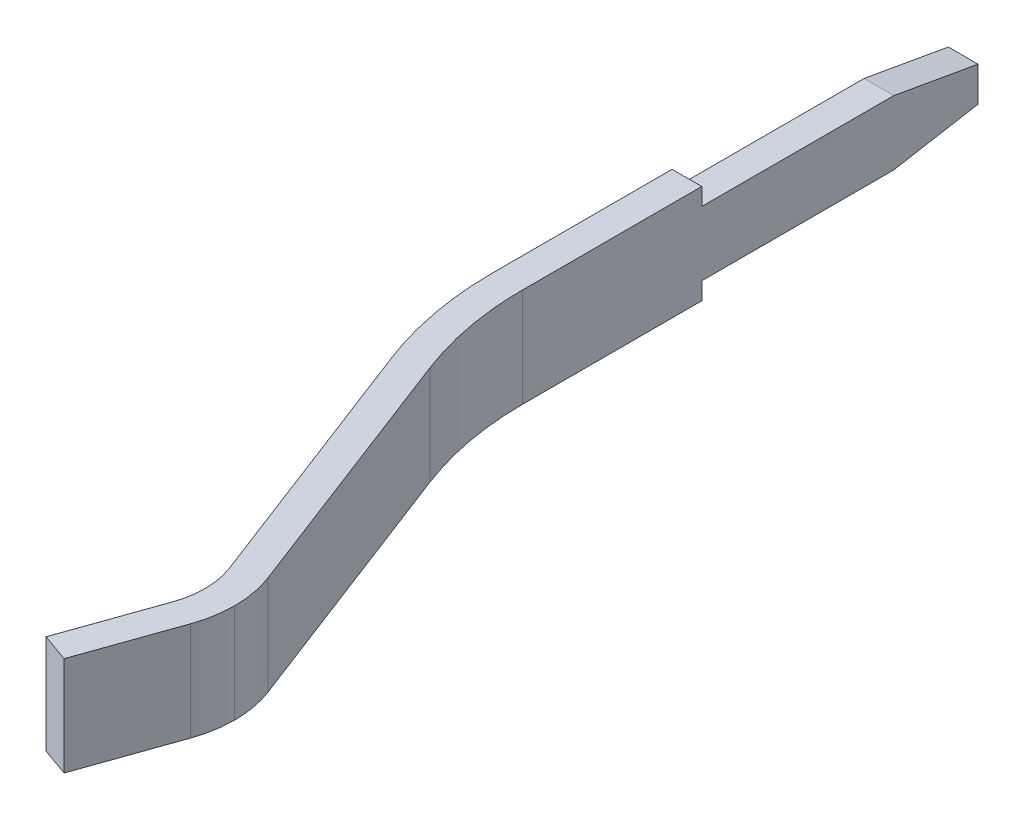
ISO-10303-21;
HEADER;
FILE_DESCRIPTION(('STEP AP214'),'2;1');
FILE_NAME('part.step','',(''),(''),'','','');
FILE_SCHEMA(('AUTOMOTIVE_DESIGN { 1 0 10303 214 1 1 1 1 }'));
ENDSEC;
DATA;
#1=APPLICATION_CONTEXT('core data for automotive mechanical design processes');
#2=APPLICATION_PROTOCOL_DEFINITION('international standard','automotive_design',2000,#1);
#3=PRODUCT_CONTEXT('',#1,'mechanical');
#4=PRODUCT('Part','Part','',(#3));
#5=PRODUCT_RELATED_PRODUCT_CATEGORY('part','',(#4));
#6=PRODUCT_DEFINITION_FORMATION('','',#4);
#7=PRODUCT_DEFINITION_CONTEXT('part definition',#1,'design');
#8=PRODUCT_DEFINITION('design','',#6,#7);
#9=PRODUCT_DEFINITION_SHAPE('','',#8);
#10=(LENGTH_UNIT() NAMED_UNIT(*) SI_UNIT(.MILLI.,.METRE.));
#11=(NAMED_UNIT(*) PLANE_ANGLE_UNIT() SI_UNIT($,.RADIAN.));
#12=(NAMED_UNIT(*) SI_UNIT($,.STERADIAN.) SOLID_ANGLE_UNIT());
#13=UNCERTAINTY_MEASURE_WITH_UNIT(LENGTH_MEASURE(1.E-05),#10,'distance_accuracy_value','');
#14=(GEOMETRIC_REPRESENTATION_CONTEXT(3) GLOBAL_UNCERTAINTY_ASSIGNED_CONTEXT((#13)) GLOBAL_UNIT_ASSIGNED_CONTEXT((#10,
#11,#12)) REPRESENTATION_CONTEXT('',''));
#15=CARTESIAN_POINT('',(0.,0.,0.));
#16=DIRECTION('',(0.,0.,1.));
#17=DIRECTION('',(1.,0.,0.));
#18=AXIS2_PLACEMENT_3D('',#15,#16,#17);
#19=CARTESIAN_POINT('',(137.95048969605,16.402694125595,6.525238669739));
#20=DIRECTION('',(4.371138828674E-08,-1.,0.));
#21=DIRECTION('',(1.,4.37113882867399E-08,-4.37114091299599E-08));
#22=AXIS2_PLACEMENT_3D('',#19,#20,#21);
#23=CYLINDRICAL_SURFACE('',#22,0.85);
#24=CARTESIAN_POINT('',(138.80048969605,16.40269416275,6.5252386325843));
#25=DIRECTION('',(4.37113956142099E-08,-0.999999999999999,0.));
#26=VECTOR('',#25,1.);
#27=LINE('',#24,#26);
#28=CARTESIAN_POINT('',(138.80048969605,16.4026941627497,6.5252386325842));
#29=VERTEX_POINT('',#28);
#30=CARTESIAN_POINT('',(138.800489739761,15.4026941627497,6.5252386325842));
#31=VERTEX_POINT('',#30);
#32=EDGE_CURVE('E166',#29,#31,#27,.T.);
#33=ORIENTED_EDGE('',*,*,#32,.T.);
#34=CARTESIAN_POINT('',(138.75187743749,15.4026941606245,6.80857196804195));
#35=CARTESIAN_POINT('',(138.800489746135,15.4026941627494,6.67107557654959));
#36=CARTESIAN_POINT('',(138.80048973976,15.4026941627494,6.525238632584));
#37=B_SPLINE_CURVE_WITH_KNOTS('',2,(#34,#35,#36),.UNSPECIFIED.,.F.,.F.,(3,3),(0.,1.),.UNSPECIFIED.);
#38=CARTESIAN_POINT('',(138.751877437488,15.4026941606248,6.80857196804117));
#39=VERTEX_POINT('',#38);
#40=EDGE_CURVE('E155',#39,#31,#37,.T.);
#41=ORIENTED_EDGE('',*,*,#40,.F.);
#42=CARTESIAN_POINT('',(138.751877437491,15.402694160625,6.80857196804195));
#43=DIRECTION('',(-4.37113956142097E-08,0.999999999999999,0.));
#44=VECTOR('',#43,1.);
#45=LINE('',#42,#44);
#46=CARTESIAN_POINT('',(138.751877393777,16.4026941606248,6.80857196804103));
#47=VERTEX_POINT('',#46);
#48=EDGE_CURVE('E162',#39,#47,#45,.T.);
#49=ORIENTED_EDGE('',*,*,#48,.T.);
#50=CARTESIAN_POINT('',(138.80048969605,16.4026941627494,6.525238632584));
#51=CARTESIAN_POINT('',(138.800489702425,16.4026941627494,6.67107557654959));
#52=CARTESIAN_POINT('',(138.75187739378,16.4026941606245,6.80857196804195));
#53=B_SPLINE_CURVE_WITH_KNOTS('',2,(#50,#51,#52),.UNSPECIFIED.,.F.,.F.,(3,3),(0.,1.),.UNSPECIFIED.);
#54=EDGE_CURVE('E170',#29,#47,#53,.T.);
#55=ORIENTED_EDGE('',*,*,#54,.F.);
#56=EDGE_LOOP('',(#33,#41,#49,#55));
#57=FACE_BOUND('',#56,.T.);
#58=ADVANCED_FACE('F18',(#57),#23,.F.);
#59=CARTESIAN_POINT('',(137.72435068274,16.40269411571,3.564294018732));
#60=DIRECTION('',(0.933579004112615,4.08080343451031E-08,-0.358371654961852));
#61=DIRECTION('',(0.,-1.,-1.13870708746334E-07));
#62=AXIS2_PLACEMENT_3D('',#59,#60,#61);
#63=PLANE('',#62);
#64=CARTESIAN_POINT('',(138.744031893251,15.402694160282,6.220622763021));
#65=DIRECTION('',(-4.37113956142095E-08,0.999999999999999,0.));
#66=VECTOR('',#65,1.);
#67=LINE('',#64,#66);
#68=CARTESIAN_POINT('',(138.744031893253,15.4026941602818,6.2206227630199));
#69=VERTEX_POINT('',#68);
#70=CARTESIAN_POINT('',(138.744031849542,16.4026941602817,6.22062276302006));
#71=VERTEX_POINT('',#70);
#72=EDGE_CURVE('E1408',#69,#71,#67,.T.);
#73=ORIENTED_EDGE('',*,*,#72,.T.);
#74=CARTESIAN_POINT('',(137.72435068274,16.4026941157099,3.564294018732));
#75=DIRECTION('',(0.35837165496185,1.56649226558017E-08,0.933579004112617));
#76=VECTOR('',#75,1.);
#77=LINE('',#74,#76);
#78=CARTESIAN_POINT('',(137.724350682742,16.40269411571,3.56429401873105));
#79=VERTEX_POINT('',#78);
#80=EDGE_CURVE('E1329',#79,#71,#77,.T.);
#81=ORIENTED_EDGE('',*,*,#80,.F.);
#82=CARTESIAN_POINT('',(137.724350726456,15.40269411571,3.5642940187301));
#83=DIRECTION('',(-4.37113956142099E-08,0.999999999999999,0.));
#84=VECTOR('',#83,1.);
#85=LINE('',#82,#84);
#86=CARTESIAN_POINT('',(137.724350726453,15.40269411571,3.5642940187309));
#87=VERTEX_POINT('',#86);
#88=EDGE_CURVE('E1343',#87,#79,#85,.T.);
#89=ORIENTED_EDGE('',*,*,#88,.F.);
#90=CARTESIAN_POINT('',(137.724350726451,15.40269411571,3.56429401873153));
#91=DIRECTION('',(0.358371654961855,1.56649250945078E-08,0.933579004112614));
#92=VECTOR('',#91,1.);
#93=LINE('',#90,#92);
#94=EDGE_CURVE('E1289',#87,#69,#93,.T.);
#95=ORIENTED_EDGE('',*,*,#94,.T.);
#96=EDGE_LOOP('',(#73,#81,#89,#95));
#97=FACE_BOUND('',#96,.T.);
#98=ADVANCED_FACE('F1441',(#97),#63,.F.);
#99=CARTESIAN_POINT('',(137.95048969605,16.402694125595,6.525238669739));
#100=DIRECTION('',(4.371138828674E-08,-1.,0.));
#101=DIRECTION('',(1.,4.37113882867399E-08,-4.37114091299599E-08));
#102=AXIS2_PLACEMENT_3D('',#99,#100,#101);
#103=CYLINDRICAL_SURFACE('',#102,0.85);
#104=CARTESIAN_POINT('',(138.744031849545,16.4026941602816,6.22062276301914));
#105=CARTESIAN_POINT('',(138.800489689164,16.4026941627494,6.36769871881936));
#106=CARTESIAN_POINT('',(138.80048969605,16.4026941627494,6.525238632584));
#107=B_SPLINE_CURVE_WITH_KNOTS('',2,(#104,#105,#106),.UNSPECIFIED.,.F.,.F.,(3,3),(0.,1.),.UNSPECIFIED.);
#108=EDGE_CURVE('E1324',#71,#29,#107,.T.);
#109=ORIENTED_EDGE('',*,*,#108,.F.);
#110=ORIENTED_EDGE('',*,*,#72,.F.);
#111=CARTESIAN_POINT('',(137.950489739761,15.402694125595,6.525238669739));
#112=DIRECTION('',(4.371138828674E-08,-1.,0.));
#113=DIRECTION('',(0.933579004111373,4.08080370965545E-08,-0.358371654965086));
#114=AXIS2_PLACEMENT_3D('',#111,#112,#113);
#115=CIRCLE('',#114,0.850000000000002);
#116=EDGE_CURVE('E193',#69,#31,#115,.T.);
#117=ORIENTED_EDGE('',*,*,#116,.T.);
#118=ORIENTED_EDGE('',*,*,#32,.F.);
#119=EDGE_LOOP('',(#109,#110,#117,#118));
#120=FACE_BOUND('',#119,.T.);
#121=ADVANCED_FACE('F1381',(#120),#103,.F.);
#122=CARTESIAN_POINT('',(138.41903472245,16.402694146076,7.749993338829));
#123=DIRECTION('',(0.942809056152527,4.12114927337194E-08,0.333333292121833));
#124=DIRECTION('',(0.,-1.,1.23634493486646E-07));
#125=AXIS2_PLACEMENT_3D('',#122,#123,#124);
#126=PLANE('',#125);
#127=CARTESIAN_POINT('',(138.419034766161,15.402694146076,7.74999333882899));
#128=DIRECTION('',(-4.37113956142092E-08,0.999999999999999,0.));
#129=VECTOR('',#128,1.);
#130=LINE('',#127,#129);
#131=CARTESIAN_POINT('',(138.419034766161,15.4026941460757,7.74999333882809));
#132=VERTEX_POINT('',#131);
#133=CARTESIAN_POINT('',(138.41903472245,16.4026941460758,7.74999333882809));
#134=VERTEX_POINT('',#133);
#135=EDGE_CURVE('E183',#132,#134,#130,.T.);
#136=ORIENTED_EDGE('',*,*,#135,.T.);
#137=CARTESIAN_POINT('',(138.751877393775,16.4026941606245,6.80857196804012));
#138=DIRECTION('',(-0.333333292121842,-1.45704604861822E-08,0.942809056152525));
#139=VECTOR('',#138,1.);
#140=LINE('',#137,#139);
#141=EDGE_CURVE('E180',#47,#134,#140,.T.);
#142=ORIENTED_EDGE('',*,*,#141,.F.);
#143=ORIENTED_EDGE('',*,*,#48,.F.);
#144=CARTESIAN_POINT('',(138.751877437486,15.402694160625,6.80857196804054));
#145=DIRECTION('',(-0.333333292121838,-1.45704674353041E-08,0.942809056152526));
#146=VECTOR('',#145,1.);
#147=LINE('',#144,#146);
#148=EDGE_CURVE('E176',#39,#132,#147,.T.);
#149=ORIENTED_EDGE('',*,*,#148,.T.);
#150=EDGE_LOOP('',(#136,#142,#143,#149));
#151=FACE_BOUND('',#150,.T.);
#152=ADVANCED_FACE('F175',(#151),#126,.F.);
#153=CARTESIAN_POINT('',(138.7018774393,16.402694158439,7.849993326465));
#154=DIRECTION('',(0.333333292121833,1.45704609608227E-08,-0.942809056152528));
#155=DIRECTION('',(0.,-1.,-1.54543073867817E-08));
#156=AXIS2_PLACEMENT_3D('',#153,#154,#155);
#157=PLANE('',#156);
#158=CARTESIAN_POINT('',(138.701877483011,15.402694158439,7.849993326465));
#159=DIRECTION('',(-4.37113956142098E-08,0.999999999999999,0.));
#160=VECTOR('',#159,1.);
#161=LINE('',#158,#160);
#162=CARTESIAN_POINT('',(138.701877483011,15.402694158439,7.849993326465));
#163=VERTEX_POINT('',#162);
#164=CARTESIAN_POINT('',(138.7018774393,16.402694158439,7.849993326465));
#165=VERTEX_POINT('',#164);
#166=EDGE_CURVE('E759',#163,#165,#161,.T.);
#167=ORIENTED_EDGE('',*,*,#166,.T.);
#168=CARTESIAN_POINT('',(138.419034722451,16.4026941460755,7.74999333882717));
#169=DIRECTION('',(0.942809056152521,4.12114902383835E-08,0.333333292121849));
#170=VECTOR('',#169,1.);
#171=LINE('',#168,#170);
#172=EDGE_CURVE('E814',#134,#165,#171,.T.);
#173=ORIENTED_EDGE('',*,*,#172,.F.);
#174=ORIENTED_EDGE('',*,*,#135,.F.);
#175=CARTESIAN_POINT('',(138.419034766161,15.4026941460756,7.74999333882675));
#176=DIRECTION('',(0.942809056152528,4.12114902383838E-08,0.333333292121831));
#177=VECTOR('',#176,1.);
#178=LINE('',#175,#177);
#179=EDGE_CURVE('E190',#132,#163,#178,.T.);
#180=ORIENTED_EDGE('',*,*,#179,.T.);
#181=EDGE_LOOP('',(#167,#173,#174,#180));
#182=FACE_BOUND('',#181,.T.);
#183=ADVANCED_FACE('F773',(#182),#157,.F.);
#184=CARTESIAN_POINT('',(138.7018774393,16.402694158439,7.849993326465));
#185=DIRECTION('',(-0.942809056152527,-4.12114927337194E-08,-0.333333292121833));
#186=DIRECTION('',(-0.333333292121833,0.,0.942809056152528));
#187=AXIS2_PLACEMENT_3D('',#184,#185,#186);
#188=PLANE('',#187);
#189=CARTESIAN_POINT('',(139.034720110625,16.402694172988,6.90857195568072));
#190=DIRECTION('',(4.37113956142097E-08,-0.999999999999999,0.));
#191=VECTOR('',#190,1.);
#192=LINE('',#189,#191);
#193=CARTESIAN_POINT('',(139.034720110624,16.402694172988,6.90857195568044));
#194=VERTEX_POINT('',#193);
#195=CARTESIAN_POINT('',(139.034720154335,15.402694172988,6.90857195568058));
#196=VERTEX_POINT('',#195);
#197=EDGE_CURVE('E735',#194,#196,#192,.T.);
#198=ORIENTED_EDGE('',*,*,#197,.F.);
#199=CARTESIAN_POINT('',(138.7018774393,16.4026941584389,7.849993326465));
#200=DIRECTION('',(0.33333329212183,1.45704604862449E-08,-0.942809056152529));
#201=VECTOR('',#200,1.);
#202=LINE('',#199,#201);
#203=EDGE_CURVE('E1314',#165,#194,#202,.T.);
#204=ORIENTED_EDGE('',*,*,#203,.F.);
#205=ORIENTED_EDGE('',*,*,#166,.F.);
#206=CARTESIAN_POINT('',(138.701877483011,15.402694158439,7.84999332646544));
#207=DIRECTION('',(0.33333329212183,1.45704587489644E-08,-0.942809056152529));
#208=VECTOR('',#207,1.);
#209=LINE('',#206,#208);
#210=EDGE_CURVE('E792',#163,#196,#209,.T.);
#211=ORIENTED_EDGE('',*,*,#210,.T.);
#212=EDGE_LOOP('',(#198,#204,#205,#211));
#213=FACE_BOUND('',#212,.T.);
#214=ADVANCED_FACE('F764',(#213),#188,.F.);
#215=CARTESIAN_POINT('',(137.95048969605,16.402694125595,6.525238669739));
#216=DIRECTION('',(4.371138828674E-08,-1.,0.));
#217=DIRECTION('',(1.,4.37113882867399E-08,-4.37114091299599E-08));
#218=AXIS2_PLACEMENT_3D('',#215,#216,#217);
#219=CYLINDRICAL_SURFACE('',#218,1.15);
#220=ORIENTED_EDGE('',*,*,#197,.T.);
#221=CARTESIAN_POINT('',(137.950489739761,15.402694125595,6.525238669739));
#222=DIRECTION('',(-4.371138828674E-08,1.,0.));
#223=DIRECTION('',(0.942809056151897,4.12114937586381E-08,0.333333292123615));
#224=AXIS2_PLACEMENT_3D('',#221,#222,#223);
#225=CIRCLE('',#224,1.14999999999999);
#226=CARTESIAN_POINT('',(139.100489739761,15.402694175863,6.52523861947092));
#227=VERTEX_POINT('',#226);
#228=EDGE_CURVE('E746',#196,#227,#225,.T.);
#229=ORIENTED_EDGE('',*,*,#228,.T.);
#230=CARTESIAN_POINT('',(139.10048969605,16.402694175863,6.52523861947088));
#231=DIRECTION('',(4.37113678586342E-08,-0.999999999999999,0.));
#232=VECTOR('',#231,1.);
#233=LINE('',#230,#232);
#234=CARTESIAN_POINT('',(139.10048969605,16.4026941758629,6.52523861947092));
#235=VERTEX_POINT('',#234);
#236=EDGE_CURVE('E713',#235,#227,#233,.T.);
#237=ORIENTED_EDGE('',*,*,#236,.F.);
#238=CARTESIAN_POINT('',(139.034720110625,16.4026941729879,6.90857195568072));
#239=CARTESIAN_POINT('',(139.100489704675,16.4026941758628,6.72254742601374));
#240=CARTESIAN_POINT('',(139.10048969605,16.4026941758628,6.525238619471));
#241=B_SPLINE_CURVE_WITH_KNOTS('',2,(#238,#239,#240),.UNSPECIFIED.,.F.,.F.,(3,3),(0.,1.),.UNSPECIFIED.);
#242=EDGE_CURVE('E724',#194,#235,#241,.T.);
#243=ORIENTED_EDGE('',*,*,#242,.F.);
#244=EDGE_LOOP('',(#220,#229,#237,#243));
#245=FACE_BOUND('',#244,.T.);
#246=ADVANCED_FACE('F683',(#245),#219,.T.);
#247=CARTESIAN_POINT('',(137.95048969605,16.402694125595,6.525238669739));
#248=DIRECTION('',(4.371138828674E-08,-1.,0.));
#249=DIRECTION('',(1.,4.37113882867399E-08,-4.37114091299599E-08));
#250=AXIS2_PLACEMENT_3D('',#247,#248,#249);
#251=CYLINDRICAL_SURFACE('',#250,1.15);
#252=CARTESIAN_POINT('',(137.950489739761,15.402694125595,6.525238669739));
#253=DIRECTION('',(-4.371138828674E-08,1.,0.));
#254=DIRECTION('',(0.999999999999998,4.37113901837717E-08,-4.37114052683237E-08));
#255=AXIS2_PLACEMENT_3D('',#252,#253,#254);
#256=CIRCLE('',#255,1.14999999999999);
#257=CARTESIAN_POINT('',(139.024105594491,15.4026941725241,6.11311126653292));
#258=VERTEX_POINT('',#257);
#259=EDGE_CURVE('E850',#227,#258,#256,.T.);
#260=ORIENTED_EDGE('',*,*,#259,.T.);
#261=CARTESIAN_POINT('',(139.024105594491,15.402694172524,6.11311126653315));
#262=DIRECTION('',(-4.37113956142098E-08,0.999999999999999,0.));
#263=VECTOR('',#262,1.);
#264=LINE('',#261,#263);
#265=CARTESIAN_POINT('',(139.02410555078,16.4026941725241,6.11311126653308));
#266=VERTEX_POINT('',#265);
#267=EDGE_CURVE('E624',#258,#266,#264,.T.);
#268=ORIENTED_EDGE('',*,*,#267,.T.);
#269=CARTESIAN_POINT('',(139.10048969605,16.4026941758628,6.525238619471));
#270=CARTESIAN_POINT('',(139.100489686733,16.4026941758628,6.31209638320274));
#271=CARTESIAN_POINT('',(139.02410555078,16.402694172524,6.11311126653315));
#272=B_SPLINE_CURVE_WITH_KNOTS('',2,(#269,#270,#271),.UNSPECIFIED.,.F.,.F.,(3,3),(0.,1.),.UNSPECIFIED.);
#273=EDGE_CURVE('E668',#235,#266,#272,.T.);
#274=ORIENTED_EDGE('',*,*,#273,.F.);
#275=ORIENTED_EDGE('',*,*,#236,.T.);
#276=EDGE_LOOP('',(#260,#268,#274,#275));
#277=FACE_BOUND('',#276,.T.);
#278=ADVANCED_FACE('F674',(#277),#251,.T.);
#279=CARTESIAN_POINT('',(139.02410555078,16.402694172524,6.113111266533));
#280=DIRECTION('',(-0.933579004112615,-4.08080343451031E-08,0.358371654961852));
#281=DIRECTION('',(-4.37113882867278E-08,1.,0.));
#282=AXIS2_PLACEMENT_3D('',#279,#280,#281);
#283=PLANE('',#282);
#284=CARTESIAN_POINT('',(138.004424427691,15.402694127953,3.45678252224401));
#285=DIRECTION('',(-4.37113678586342E-08,0.999999999999999,0.));
#286=VECTOR('',#285,1.);
#287=LINE('',#284,#286);
#288=CARTESIAN_POINT('',(138.004424427691,15.4026941279526,3.45678252224391));
#289=VERTEX_POINT('',#288);
#290=CARTESIAN_POINT('',(138.00442438398,16.4026941279525,3.45678252224406));
#291=VERTEX_POINT('',#290);
#292=EDGE_CURVE('E530',#289,#291,#287,.T.);
#293=ORIENTED_EDGE('',*,*,#292,.T.);
#294=CARTESIAN_POINT('',(139.02410555078,16.402694172524,6.113111266533));
#295=DIRECTION('',(-0.358371654961849,-1.56649226558016E-08,-0.933579004112617));
#296=VECTOR('',#295,1.);
#297=LINE('',#294,#296);
#298=EDGE_CURVE('E635',#266,#291,#297,.T.);
#299=ORIENTED_EDGE('',*,*,#298,.F.);
#300=ORIENTED_EDGE('',*,*,#267,.F.);
#301=CARTESIAN_POINT('',(139.024105594491,15.402694172524,6.11311126653253));
#302=DIRECTION('',(-0.358371654961849,-1.56649220461251E-08,-0.933579004112617));
#303=VECTOR('',#302,1.);
#304=LINE('',#301,#303);
#305=EDGE_CURVE('E655',#258,#289,#304,.T.);
#306=ORIENTED_EDGE('',*,*,#305,.T.);
#307=EDGE_LOOP('',(#293,#299,#300,#306));
#308=FACE_BOUND('',#307,.T.);
#309=ADVANCED_FACE('F591',(#308),#283,.F.);
#310=CARTESIAN_POINT('',(140.99187719714,16.402694258538,2.309993226366));
#311=DIRECTION('',(4.371138828674E-08,-1.,0.));
#312=DIRECTION('',(1.,4.37113882867399E-08,-4.37114091299599E-08));
#313=AXIS2_PLACEMENT_3D('',#310,#311,#312);
#314=CYLINDRICAL_SURFACE('',#313,3.5);
#315=CARTESIAN_POINT('',(137.49187719714,16.4026941055481,2.30999337935593));
#316=CARTESIAN_POINT('',(137.491877225495,16.4026941055481,2.95868714191033));
#317=CARTESIAN_POINT('',(137.724350682745,16.4026941157099,3.5642940187301));
#318=B_SPLINE_CURVE_WITH_KNOTS('',2,(#315,#316,#317),.UNSPECIFIED.,.F.,.F.,(3,3),(0.,1.),.UNSPECIFIED.);
#319=CARTESIAN_POINT('',(137.491877197136,16.4026941055486,2.30999337935598));
#320=VERTEX_POINT('',#319);
#321=EDGE_CURVE('E1335',#320,#79,#318,.T.);
#322=ORIENTED_EDGE('',*,*,#321,.F.);
#323=CARTESIAN_POINT('',(137.49187719714,16.402694105549,2.30999337935599));
#324=DIRECTION('',(4.37113956142097E-08,-0.999999999999999,0.));
#325=VECTOR('',#324,1.);
#326=LINE('',#323,#325);
#327=CARTESIAN_POINT('',(137.491877240847,15.4026941055485,2.30999337935598));
#328=VERTEX_POINT('',#327);
#329=EDGE_CURVE('E611',#320,#328,#326,.T.);
#330=ORIENTED_EDGE('',*,*,#329,.T.);
#331=CARTESIAN_POINT('',(140.991877240851,15.402694258538,2.309993226366));
#332=DIRECTION('',(-4.371138828674E-08,1.,0.));
#333=DIRECTION('',(-0.999999999999998,-4.37113876840453E-08,4.37114070138212E-08));
#334=AXIS2_PLACEMENT_3D('',#331,#332,#333);
#335=CIRCLE('',#334,3.50000000000001);
#336=EDGE_CURVE('E576',#328,#87,#335,.T.);
#337=ORIENTED_EDGE('',*,*,#336,.T.);
#338=ORIENTED_EDGE('',*,*,#88,.T.);
#339=EDGE_LOOP('',(#322,#330,#337,#338));
#340=FACE_BOUND('',#339,.T.);
#341=ADVANCED_FACE('F582',(#340),#314,.T.);
#342=CARTESIAN_POINT('',(140.99187719714,16.402694258538,2.309993226366));
#343=DIRECTION('',(4.371138828674E-08,-1.,0.));
#344=DIRECTION('',(1.,4.37113882867399E-08,-4.37114091299599E-08));
#345=AXIS2_PLACEMENT_3D('',#342,#343,#344);
#346=CYLINDRICAL_SURFACE('',#345,3.2);
#347=CARTESIAN_POINT('',(137.791877240851,15.402694118662,2.309993366243));
#348=DIRECTION('',(-4.37113956142097E-08,0.999999999999999,0.));
#349=VECTOR('',#348,1.);
#350=LINE('',#347,#349);
#351=CARTESIAN_POINT('',(137.791877240851,15.4026941186618,2.30999336624283));
#352=VERTEX_POINT('',#351);
#353=CARTESIAN_POINT('',(137.79187719714,16.4026941186618,2.30999336624283));
#354=VERTEX_POINT('',#353);
#355=EDGE_CURVE('E553',#352,#354,#350,.T.);
#356=ORIENTED_EDGE('',*,*,#355,.T.);
#357=CARTESIAN_POINT('',(138.00442438398,16.4026941279523,3.45678252224411));
#358=CARTESIAN_POINT('',(137.791877223065,16.4026941186616,2.90308480629357));
#359=CARTESIAN_POINT('',(137.79187719714,16.4026941186616,2.30999336624251));
#360=B_SPLINE_CURVE_WITH_KNOTS('',2,(#357,#358,#359),.UNSPECIFIED.,.F.,.F.,(3,3),(0.,1.),.UNSPECIFIED.);
#361=EDGE_CURVE('E541',#291,#354,#360,.T.);
#362=ORIENTED_EDGE('',*,*,#361,.F.);
#363=ORIENTED_EDGE('',*,*,#292,.F.);
#364=CARTESIAN_POINT('',(140.991877240851,15.402694258538,2.309993226366));
#365=DIRECTION('',(4.371138828674E-08,-1.,0.));
#366=DIRECTION('',(-0.933579004112648,-4.08080340352778E-08,0.358371654961764));
#367=AXIS2_PLACEMENT_3D('',#364,#365,#366);
#368=CIRCLE('',#367,3.20000000000001);
#369=EDGE_CURVE('E563',#289,#352,#368,.T.);
#370=ORIENTED_EDGE('',*,*,#369,.T.);
#371=EDGE_LOOP('',(#356,#362,#363,#370));
#372=FACE_BOUND('',#371,.T.);
#373=ADVANCED_FACE('F446',(#372),#346,.F.);
#374=CARTESIAN_POINT('',(140.99187719714,16.402694258538,2.309993226366));
#375=DIRECTION('',(-4.371138828674E-08,1.,0.));
#376=DIRECTION('',(0.,0.,1.));
#377=AXIS2_PLACEMENT_3D('',#374,#375,#376);
#378=PLANE('',#377);
#379=ORIENTED_EDGE('',*,*,#361,.T.);
#380=CARTESIAN_POINT('',(137.79187719714,16.4026941186616,2.309993366243));
#381=DIRECTION('',(-4.3711412635585E-08,0.,-0.999999999999999));
#382=VECTOR('',#381,1.);
#383=LINE('',#380,#382);
#384=CARTESIAN_POINT('',(137.791877118021,16.4026941186618,0.499993366242733));
#385=VERTEX_POINT('',#384);
#386=EDGE_CURVE('E517',#354,#385,#383,.T.);
#387=ORIENTED_EDGE('',*,*,#386,.T.);
#388=CARTESIAN_POINT('',(137.79187711802,16.4026941186616,0.499993366242465));
#389=DIRECTION('',(-0.999999999999998,-4.37113886753126E-08,4.37114175873706E-08));
#390=VECTOR('',#389,1.);
#391=LINE('',#388,#390);
#392=CARTESIAN_POINT('',(137.491877118017,16.4026941055486,0.499993379355944));
#393=VERTEX_POINT('',#392);
#394=EDGE_CURVE('E295',#385,#393,#391,.T.);
#395=ORIENTED_EDGE('',*,*,#394,.T.);
#396=CARTESIAN_POINT('',(137.491877118015,16.4026941055481,0.499993379356));
#397=DIRECTION('',(4.3711412635585E-08,0.,0.999999999999999));
#398=VECTOR('',#397,1.);
#399=LINE('',#396,#398);
#400=EDGE_CURVE('E892',#393,#320,#399,.T.);
#401=ORIENTED_EDGE('',*,*,#400,.T.);
#402=ORIENTED_EDGE('',*,*,#321,.T.);
#403=ORIENTED_EDGE('',*,*,#80,.T.);
#404=ORIENTED_EDGE('',*,*,#108,.T.);
#405=ORIENTED_EDGE('',*,*,#54,.T.);
#406=ORIENTED_EDGE('',*,*,#141,.T.);
#407=ORIENTED_EDGE('',*,*,#172,.T.);
#408=ORIENTED_EDGE('',*,*,#203,.T.);
#409=ORIENTED_EDGE('',*,*,#242,.T.);
#410=ORIENTED_EDGE('',*,*,#273,.T.);
#411=ORIENTED_EDGE('',*,*,#298,.T.);
#412=EDGE_LOOP('',(#379,#387,#395,#401,#402,#403,#404,#405,#406,#407,#408,#409,#410,#411));
#413=FACE_BOUND('',#412,.T.);
#414=ADVANCED_FACE('F437',(#413),#378,.T.);
#415=CARTESIAN_POINT('',(140.60074247018,16.227694241441,-1.440006756537));
#416=DIRECTION('',(5.06426583573572E-08,-0.984783558817946,0.173785333908991));
#417=DIRECTION('',(-1.,-5.14251663768072E-08,0.));
#418=AXIS2_PLACEMENT_3D('',#415,#416,#417);
#419=PLANE('',#418);
#420=CARTESIAN_POINT('',(137.79187701027,16.0776941186616,-2.29000663375754));
#421=DIRECTION('',(-0.999999999999998,-4.37113886753126E-08,4.37114103593561E-08));
#422=VECTOR('',#421,1.);
#423=LINE('',#420,#422);
#424=CARTESIAN_POINT('',(137.791877010271,16.0776941186618,-2.29000663375709));
#425=VERTEX_POINT('',#424);
#426=CARTESIAN_POINT('',(137.491877010268,16.0776941055486,-2.29000662064386));
#427=VERTEX_POINT('',#426);
#428=EDGE_CURVE('E410',#425,#427,#423,.T.);
#429=ORIENTED_EDGE('',*,*,#428,.T.);
#430=CARTESIAN_POINT('',(137.491877010272,16.0776941055483,-2.29000662064387));
#431=DIRECTION('',(3.54498867611369E-08,0.173785333908992,0.984783558817946));
#432=VECTOR('',#431,1.);
#433=LINE('',#430,#432);
#434=CARTESIAN_POINT('',(137.491877040868,16.2276941055484,-1.44000662064401));
#435=VERTEX_POINT('',#434);
#436=EDGE_CURVE('E399',#427,#435,#433,.T.);
#437=ORIENTED_EDGE('',*,*,#436,.T.);
#438=CARTESIAN_POINT('',(137.49187704087,16.2276941055482,-1.44000662064411));
#439=DIRECTION('',(0.999999999999998,4.37113886753167E-08,-4.37114096365587E-08));
#440=VECTOR('',#439,1.);
#441=LINE('',#438,#440);
#442=CARTESIAN_POINT('',(137.791877040871,16.2276941186617,-1.44000663375717));
#443=VERTEX_POINT('',#442);
#444=EDGE_CURVE('E387',#435,#443,#441,.T.);
#445=ORIENTED_EDGE('',*,*,#444,.T.);
#446=CARTESIAN_POINT('',(137.79187704087,16.2276941186617,-1.44000663375695));
#447=DIRECTION('',(-3.54498867611369E-08,-0.173785333908992,-0.984783558817946));
#448=VECTOR('',#447,1.);
#449=LINE('',#446,#448);
#450=EDGE_CURVE('E421',#443,#425,#449,.T.);
#451=ORIENTED_EDGE('',*,*,#450,.T.);
#452=EDGE_LOOP('',(#429,#437,#445,#451));
#453=FACE_BOUND('',#452,.T.);
#454=ADVANCED_FACE('F355',(#453),#419,.F.);
#455=CARTESIAN_POINT('',(140.60074255498,16.227694241441,0.499993243463));
#456=DIRECTION('',(4.371138828674E-08,-1.,0.));
#457=DIRECTION('',(0.,0.,-1.));
#458=AXIS2_PLACEMENT_3D('',#455,#456,#457);
#459=PLANE('',#458);
#460=ORIENTED_EDGE('',*,*,#444,.F.);
#461=CARTESIAN_POINT('',(137.49187704087,16.2276941055482,-1.440006620644));
#462=DIRECTION('',(4.37114119241873E-08,0.,0.999999999999999));
#463=VECTOR('',#462,1.);
#464=LINE('',#461,#463);
#465=CARTESIAN_POINT('',(137.491877125668,16.2276941055486,0.499993379355945));
#466=VERTEX_POINT('',#465);
#467=EDGE_CURVE('E884',#435,#466,#464,.T.);
#468=ORIENTED_EDGE('',*,*,#467,.T.);
#469=CARTESIAN_POINT('',(137.49187712567,16.2276941055482,0.499993379355889));
#470=DIRECTION('',(0.999999999999998,4.37113886753126E-08,-4.37114092751539E-08));
#471=VECTOR('',#470,1.);
#472=LINE('',#469,#471);
#473=CARTESIAN_POINT('',(137.791877125671,16.2276941186618,0.499993366242733));
#474=VERTEX_POINT('',#473);
#475=EDGE_CURVE('E320',#466,#474,#472,.T.);
#476=ORIENTED_EDGE('',*,*,#475,.T.);
#477=CARTESIAN_POINT('',(137.79187712567,16.2276941186616,0.499993366243));
#478=DIRECTION('',(-4.37114119241873E-08,0.,-0.999999999999999));
#479=VECTOR('',#478,1.);
#480=LINE('',#477,#479);
#481=EDGE_CURVE('E375',#474,#443,#480,.T.);
#482=ORIENTED_EDGE('',*,*,#481,.T.);
#483=EDGE_LOOP('',(#460,#468,#476,#482));
#484=FACE_BOUND('',#483,.T.);
#485=ADVANCED_FACE('F346',(#484),#459,.F.);
#486=CARTESIAN_POINT('',(140.60074255498,16.227694241441,0.499993243463));
#487=DIRECTION('',(4.37114091771E-08,0.,1.));
#488=DIRECTION('',(4.37113882867448E-08,-1.,0.));
#489=AXIS2_PLACEMENT_3D('',#486,#487,#488);
#490=PLANE('',#489);
#491=ORIENTED_EDGE('',*,*,#475,.F.);
#492=CARTESIAN_POINT('',(137.49187712567,16.227694105549,0.499993379355889));
#493=DIRECTION('',(-4.37113837189628E-08,0.999999999999999,0.));
#494=VECTOR('',#493,1.);
#495=LINE('',#492,#494);
#496=EDGE_CURVE('E308',#466,#393,#495,.T.);
#497=ORIENTED_EDGE('',*,*,#496,.T.);
#498=ORIENTED_EDGE('',*,*,#394,.F.);
#499=CARTESIAN_POINT('',(137.79187711802,16.402694118662,0.499993366242466));
#500=DIRECTION('',(4.37113837189628E-08,-0.999999999999999,0.));
#501=VECTOR('',#500,1.);
#502=LINE('',#499,#501);
#503=EDGE_CURVE('E330',#385,#474,#502,.T.);
#504=ORIENTED_EDGE('',*,*,#503,.T.);
#505=EDGE_LOOP('',(#491,#497,#498,#504));
#506=FACE_BOUND('',#505,.T.);
#507=ADVANCED_FACE('F212',(#506),#490,.F.);
#508=CARTESIAN_POINT('',(140.99187724085,15.402694258538,2.309993226366));
#509=DIRECTION('',(-4.371138828674E-08,1.,0.));
#510=DIRECTION('',(0.,0.,1.));
#511=AXIS2_PLACEMENT_3D('',#508,#509,#510);
#512=PLANE('',#511);
#513=CARTESIAN_POINT('',(137.49187716173,15.4026941055481,0.49999337935589));
#514=DIRECTION('',(0.999999999999998,4.37113886753126E-08,-4.37114175873706E-08));
#515=VECTOR('',#514,1.);
#516=LINE('',#513,#515);
#517=CARTESIAN_POINT('',(137.491877161728,15.4026941055486,0.499993379355944));
#518=VERTEX_POINT('',#517);
#519=CARTESIAN_POINT('',(137.791877161732,15.4026941186618,0.499993366242733));
#520=VERTEX_POINT('',#519);
#521=EDGE_CURVE('E931',#518,#520,#516,.T.);
#522=ORIENTED_EDGE('',*,*,#521,.T.);
#523=CARTESIAN_POINT('',(137.791877161732,15.4026941186616,0.499993366243));
#524=DIRECTION('',(4.37113973010128E-08,0.,0.999999999999999));
#525=VECTOR('',#524,1.);
#526=LINE('',#523,#525);
#527=EDGE_CURVE('E904',#520,#352,#526,.T.);
#528=ORIENTED_EDGE('',*,*,#527,.T.);
#529=ORIENTED_EDGE('',*,*,#369,.F.);
#530=ORIENTED_EDGE('',*,*,#305,.F.);
#531=ORIENTED_EDGE('',*,*,#259,.F.);
#532=ORIENTED_EDGE('',*,*,#228,.F.);
#533=ORIENTED_EDGE('',*,*,#210,.F.);
#534=ORIENTED_EDGE('',*,*,#179,.F.);
#535=ORIENTED_EDGE('',*,*,#148,.F.);
#536=ORIENTED_EDGE('',*,*,#40,.T.);
#537=ORIENTED_EDGE('',*,*,#116,.F.);
#538=ORIENTED_EDGE('',*,*,#94,.F.);
#539=ORIENTED_EDGE('',*,*,#336,.F.);
#540=CARTESIAN_POINT('',(137.491877240842,15.4026941055481,2.309993379356));
#541=DIRECTION('',(-4.3711412635585E-08,0.,-0.999999999999999));
#542=VECTOR('',#541,1.);
#543=LINE('',#540,#542);
#544=EDGE_CURVE('E281',#328,#518,#543,.T.);
#545=ORIENTED_EDGE('',*,*,#544,.T.);
#546=EDGE_LOOP('',(#522,#528,#529,#530,#531,#532,#533,#534,#535,#536,#537,#538,#539,#545));
#547=FACE_BOUND('',#546,.T.);
#548=ADVANCED_FACE('F188',(#547),#512,.F.);
#549=CARTESIAN_POINT('',(137.79187699606,16.402694118662,-2.290006633757));
#550=DIRECTION('',(4.371140912996E-08,0.,1.));
#551=DIRECTION('',(4.37113882867346E-08,-1.,0.));
#552=AXIS2_PLACEMENT_3D('',#549,#550,#551);
#553=PLANE('',#552);
#554=ORIENTED_EDGE('',*,*,#428,.F.);
#555=CARTESIAN_POINT('',(137.791877010266,16.077694118662,-2.290006633757));
#556=DIRECTION('',(4.37113837189632E-08,-0.999999999999999,0.));
#557=VECTOR('',#556,1.);
#558=LINE('',#555,#557);
#559=CARTESIAN_POINT('',(137.79187702557,15.7276941186618,-2.2900066337571));
#560=VERTEX_POINT('',#559);
#561=EDGE_CURVE('E900',#425,#560,#558,.T.);
#562=ORIENTED_EDGE('',*,*,#561,.T.);
#563=CARTESIAN_POINT('',(137.79187702557,15.7276941186616,-2.290006633757));
#564=DIRECTION('',(-0.999999999999998,-4.37113886753167E-08,4.37114089137572E-08));
#565=VECTOR('',#564,1.);
#566=LINE('',#563,#565);
#567=CARTESIAN_POINT('',(137.491877025568,15.7276941055486,-2.2900066206439));
#568=VERTEX_POINT('',#567);
#569=EDGE_CURVE('E967',#560,#568,#566,.T.);
#570=ORIENTED_EDGE('',*,*,#569,.T.);
#571=CARTESIAN_POINT('',(137.491877025565,15.727694105549,-2.29000662064358));
#572=DIRECTION('',(-4.37113837189632E-08,0.999999999999999,0.));
#573=VECTOR('',#572,1.);
#574=LINE('',#571,#573);
#575=EDGE_CURVE('E874',#568,#427,#574,.T.);
#576=ORIENTED_EDGE('',*,*,#575,.T.);
#577=EDGE_LOOP('',(#554,#562,#570,#576));
#578=FACE_BOUND('',#577,.T.);
#579=ADVANCED_FACE('F211',(#578),#553,.F.);
#580=CARTESIAN_POINT('',(137.49187699606,16.402694105549,-2.290006620644));
#581=DIRECTION('',(1.,4.371138828674E-08,-4.37114091771E-08));
#582=DIRECTION('',(0.,-0.707106950155213,-0.707106612217841));
#583=AXIS2_PLACEMENT_3D('',#580,#581,#582);
#584=PLANE('',#583);
#585=ORIENTED_EDGE('',*,*,#496,.F.);
#586=ORIENTED_EDGE('',*,*,#467,.F.);
#587=ORIENTED_EDGE('',*,*,#436,.F.);
#588=ORIENTED_EDGE('',*,*,#575,.F.);
#589=CARTESIAN_POINT('',(137.491877025565,15.727694105549,-2.290006620644));
#590=DIRECTION('',(5.06426953730528E-08,-0.17378533390899,0.984783558817946));
#591=VECTOR('',#590,1.);
#592=LINE('',#589,#591);
#593=CARTESIAN_POINT('',(137.491877069279,15.5776941055485,-1.44000662064406));
#594=VERTEX_POINT('',#593);
#595=EDGE_CURVE('E971',#568,#594,#592,.T.);
#596=ORIENTED_EDGE('',*,*,#595,.T.);
#597=CARTESIAN_POINT('',(137.491877069277,15.577694105549,-1.440006620644));
#598=DIRECTION('',(4.37114119241873E-08,0.,0.999999999999999));
#599=VECTOR('',#598,1.);
#600=LINE('',#597,#599);
#601=CARTESIAN_POINT('',(137.491877154079,15.5776941055486,0.499993379355944));
#602=VERTEX_POINT('',#601);
#603=EDGE_CURVE('E945',#594,#602,#600,.T.);
#604=ORIENTED_EDGE('',*,*,#603,.T.);
#605=CARTESIAN_POINT('',(137.491877154077,15.577694105549,0.499993379356005));
#606=DIRECTION('',(4.37113837189628E-08,-0.999999999999999,0.));
#607=VECTOR('',#606,1.);
#608=LINE('',#605,#607);
#609=EDGE_CURVE('E926',#602,#518,#608,.T.);
#610=ORIENTED_EDGE('',*,*,#609,.T.);
#611=ORIENTED_EDGE('',*,*,#544,.F.);
#612=ORIENTED_EDGE('',*,*,#329,.F.);
#613=ORIENTED_EDGE('',*,*,#400,.F.);
#614=EDGE_LOOP('',(#585,#586,#587,#588,#596,#604,#610,#611,#612,#613));
#615=FACE_BOUND('',#614,.T.);
#616=ADVANCED_FACE('F1117',(#615),#584,.F.);
#617=CARTESIAN_POINT('',(137.79187719714,16.402694118662,2.309993366243));
#618=DIRECTION('',(-1.,-4.37113882867399E-08,4.37114092478099E-08));
#619=DIRECTION('',(-4.371138828674E-08,1.,0.));
#620=AXIS2_PLACEMENT_3D('',#617,#618,#619);
#621=PLANE('',#620);
#622=ORIENTED_EDGE('',*,*,#503,.F.);
#623=ORIENTED_EDGE('',*,*,#386,.F.);
#624=ORIENTED_EDGE('',*,*,#355,.F.);
#625=ORIENTED_EDGE('',*,*,#527,.F.);
#626=CARTESIAN_POINT('',(137.791877161734,15.402694118662,0.499993366242996));
#627=DIRECTION('',(-4.37113837189628E-08,0.999999999999999,0.));
#628=VECTOR('',#627,1.);
#629=LINE('',#626,#628);
#630=CARTESIAN_POINT('',(137.791877154081,15.5776941186618,0.499993366242733));
#631=VERTEX_POINT('',#630);
#632=EDGE_CURVE('E940',#520,#631,#629,.T.);
#633=ORIENTED_EDGE('',*,*,#632,.T.);
#634=CARTESIAN_POINT('',(137.791877154084,15.577694118662,0.499993366242996));
#635=DIRECTION('',(-4.37114119241872E-08,0.,-0.999999999999999));
#636=VECTOR('',#635,1.);
#637=LINE('',#634,#636);
#638=CARTESIAN_POINT('',(137.791877069282,15.5776941186617,-1.44000663375719));
#639=VERTEX_POINT('',#638);
#640=EDGE_CURVE('E37',#631,#639,#637,.T.);
#641=ORIENTED_EDGE('',*,*,#640,.T.);
#642=CARTESIAN_POINT('',(137.791877069284,15.5776941186621,-1.44000663375701));
#643=DIRECTION('',(-5.06426632163067E-08,0.173785333908984,-0.984783558817947));
#644=VECTOR('',#643,1.);
#645=LINE('',#642,#644);
#646=EDGE_CURVE('E11',#639,#560,#645,.T.);
#647=ORIENTED_EDGE('',*,*,#646,.T.);
#648=ORIENTED_EDGE('',*,*,#561,.F.);
#649=ORIENTED_EDGE('',*,*,#450,.F.);
#650=ORIENTED_EDGE('',*,*,#481,.F.);
#651=EDGE_LOOP('',(#622,#623,#624,#625,#633,#641,#647,#648,#649,#650));
#652=FACE_BOUND('',#651,.T.);
#653=ADVANCED_FACE('F1109',(#652),#621,.F.);
#654=CARTESIAN_POINT('',(140.60074259104,15.402694241441,0.499993243463));
#655=DIRECTION('',(4.37114091771E-08,0.,1.));
#656=DIRECTION('',(4.37113882867448E-08,-1.,0.));
#657=AXIS2_PLACEMENT_3D('',#654,#655,#656);
#658=PLANE('',#657);
#659=ORIENTED_EDGE('',*,*,#521,.F.);
#660=ORIENTED_EDGE('',*,*,#609,.F.);
#661=CARTESIAN_POINT('',(137.49187715408,15.5776941055482,0.499993379355889));
#662=DIRECTION('',(0.999999999999998,4.37113886753167E-08,-4.37114092751579E-08));
#663=VECTOR('',#662,1.);
#664=LINE('',#661,#663);
#665=EDGE_CURVE('E953',#602,#631,#664,.T.);
#666=ORIENTED_EDGE('',*,*,#665,.T.);
#667=ORIENTED_EDGE('',*,*,#632,.F.);
#668=EDGE_LOOP('',(#659,#660,#666,#667));
#669=FACE_BOUND('',#668,.T.);
#670=ADVANCED_FACE('F1040',(#669),#658,.F.);
#671=CARTESIAN_POINT('',(140.60074249859,15.577694241441,-1.440006756537));
#672=DIRECTION('',(-4.371138828674E-08,1.,0.));
#673=DIRECTION('',(0.,0.,1.));
#674=AXIS2_PLACEMENT_3D('',#671,#672,#673);
#675=PLANE('',#674);
#676=ORIENTED_EDGE('',*,*,#665,.F.);
#677=ORIENTED_EDGE('',*,*,#603,.F.);
#678=CARTESIAN_POINT('',(137.49187706928,15.5776941055482,-1.44000662064411));
#679=DIRECTION('',(0.999999999999998,4.37113886753167E-08,-4.37114096365587E-08));
#680=VECTOR('',#679,1.);
#681=LINE('',#678,#680);
#682=EDGE_CURVE('E30',#594,#639,#681,.T.);
#683=ORIENTED_EDGE('',*,*,#682,.T.);
#684=ORIENTED_EDGE('',*,*,#640,.F.);
#685=EDGE_LOOP('',(#676,#677,#683,#684));
#686=FACE_BOUND('',#685,.T.);
#687=ADVANCED_FACE('F992',(#686),#675,.F.);
#688=CARTESIAN_POINT('',(140.60074245488,15.727694241441,-2.290006756537));
#689=DIRECTION('',(-3.54498546784081E-08,0.984783558817946,0.173785333908991));
#690=DIRECTION('',(0.999999999999979,0.,2.03986457781138E-07));
#691=AXIS2_PLACEMENT_3D('',#688,#689,#690);
#692=PLANE('',#691);
#693=ORIENTED_EDGE('',*,*,#682,.F.);
#694=ORIENTED_EDGE('',*,*,#595,.F.);
#695=ORIENTED_EDGE('',*,*,#569,.F.);
#696=ORIENTED_EDGE('',*,*,#646,.F.);
#697=EDGE_LOOP('',(#693,#694,#695,#696));
#698=FACE_BOUND('',#697,.T.);
#699=ADVANCED_FACE('F1000',(#698),#692,.F.);
#700=CLOSED_SHELL('',(#58,#98,#121,#152,#183,#214,#246,#278,#309,#341,#373,#414,#454,#485,#507,
#548,#579,#616,#653,#670,#687,#699));
#701=MANIFOLD_SOLID_BREP('B1',#700);
#702=ADVANCED_BREP_SHAPE_REPRESENTATION('',(#18,#701),#14);
#703=SHAPE_DEFINITION_REPRESENTATION(#9,#702);
ENDSEC;
END-ISO-10303-21;
